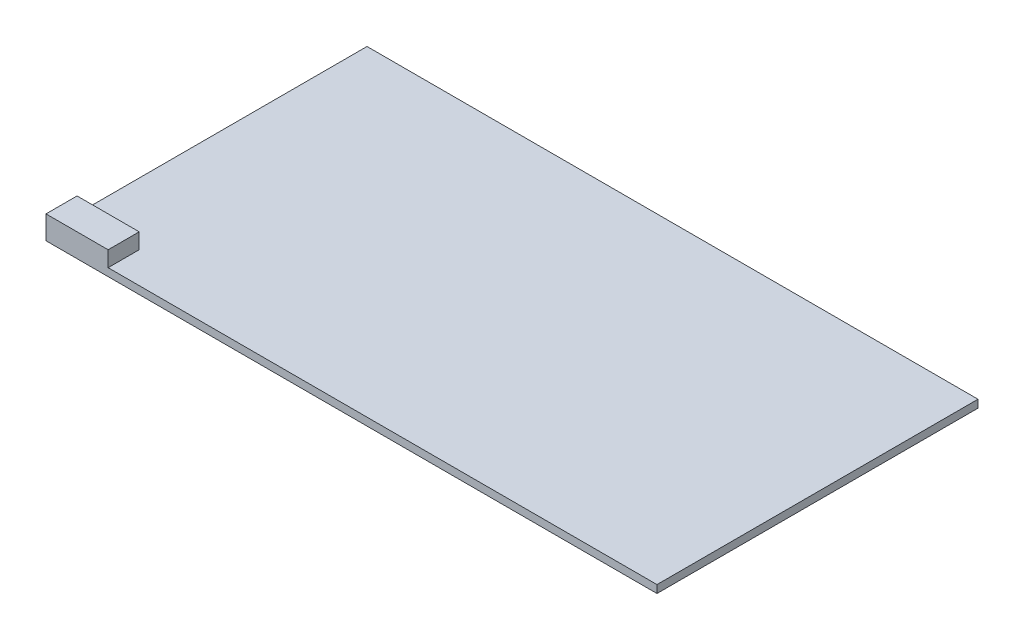
ISO-10303-21;
HEADER;
FILE_DESCRIPTION(('STEP AP214'),'2;1');
FILE_NAME('part.step','',(''),(''),'','','');
FILE_SCHEMA(('AUTOMOTIVE_DESIGN { 1 0 10303 214 1 1 1 1 }'));
ENDSEC;
DATA;
#1=APPLICATION_CONTEXT('core data for automotive mechanical design processes');
#2=APPLICATION_PROTOCOL_DEFINITION('international standard','automotive_design',2000,#1);
#3=PRODUCT_CONTEXT('',#1,'mechanical');
#4=PRODUCT('Part','Part','',(#3));
#5=PRODUCT_RELATED_PRODUCT_CATEGORY('part','',(#4));
#6=PRODUCT_DEFINITION_FORMATION('','',#4);
#7=PRODUCT_DEFINITION_CONTEXT('part definition',#1,'design');
#8=PRODUCT_DEFINITION('design','',#6,#7);
#9=PRODUCT_DEFINITION_SHAPE('','',#8);
#10=(LENGTH_UNIT() NAMED_UNIT(*) SI_UNIT(.MILLI.,.METRE.));
#11=(NAMED_UNIT(*) PLANE_ANGLE_UNIT() SI_UNIT($,.RADIAN.));
#12=(NAMED_UNIT(*) SI_UNIT($,.STERADIAN.) SOLID_ANGLE_UNIT());
#13=UNCERTAINTY_MEASURE_WITH_UNIT(LENGTH_MEASURE(1.E-05),#10,'distance_accuracy_value','');
#14=(GEOMETRIC_REPRESENTATION_CONTEXT(3) GLOBAL_UNCERTAINTY_ASSIGNED_CONTEXT((#13)) GLOBAL_UNIT_ASSIGNED_CONTEXT((#10,
#11,#12)) REPRESENTATION_CONTEXT('',''));
#15=CARTESIAN_POINT('',(0.,0.,0.));
#16=DIRECTION('',(0.,0.,1.));
#17=DIRECTION('',(1.,0.,0.));
#18=AXIS2_PLACEMENT_3D('',#15,#16,#17);
#19=CARTESIAN_POINT('',(0.,1.5,-62.));
#20=DIRECTION('',(1.,0.,0.));
#21=DIRECTION('',(0.,0.,-1.));
#22=AXIS2_PLACEMENT_3D('',#19,#20,#21);
#23=PLANE('',#22);
#24=DIRECTION('',(0.,0.,1.));
#25=VECTOR('',#24,1.);
#26=CARTESIAN_POINT('',(0.,0.,-62.));
#27=LINE('',#26,#25);
#28=CARTESIAN_POINT('',(0.,0.,-62.));
#29=VERTEX_POINT('',#28);
#30=CARTESIAN_POINT('',(0.,0.,0.));
#31=VERTEX_POINT('',#30);
#32=EDGE_CURVE('E111',#29,#31,#27,.T.);
#33=ORIENTED_EDGE('',*,*,#32,.T.);
#34=DIRECTION('',(0.,-1.,0.));
#35=VECTOR('',#34,1.);
#36=CARTESIAN_POINT('',(0.,1.5,0.));
#37=LINE('',#36,#35);
#38=CARTESIAN_POINT('',(0.,4.5,0.));
#39=VERTEX_POINT('',#38);
#40=EDGE_CURVE('E11',#39,#31,#37,.T.);
#41=ORIENTED_EDGE('',*,*,#40,.F.);
#42=DIRECTION('',(0.,0.,1.));
#43=VECTOR('',#42,1.);
#44=CARTESIAN_POINT('',(0.,4.5,-6.));
#45=LINE('',#44,#43);
#46=CARTESIAN_POINT('',(0.,4.5,-6.));
#47=VERTEX_POINT('',#46);
#48=EDGE_CURVE('E108',#47,#39,#45,.T.);
#49=ORIENTED_EDGE('',*,*,#48,.F.);
#50=DIRECTION('',(0.,-1.,0.));
#51=VECTOR('',#50,1.);
#52=CARTESIAN_POINT('',(0.,4.5,-6.));
#53=LINE('',#52,#51);
#54=CARTESIAN_POINT('',(0.,1.5,-6.));
#55=VERTEX_POINT('',#54);
#56=EDGE_CURVE('E137',#47,#55,#53,.T.);
#57=ORIENTED_EDGE('',*,*,#56,.T.);
#58=DIRECTION('',(0.,0.,1.));
#59=VECTOR('',#58,1.);
#60=CARTESIAN_POINT('',(0.,1.5,-62.));
#61=LINE('',#60,#59);
#62=CARTESIAN_POINT('',(0.,1.5,-62.));
#63=VERTEX_POINT('',#62);
#64=EDGE_CURVE('E68',#63,#55,#61,.T.);
#65=ORIENTED_EDGE('',*,*,#64,.F.);
#66=DIRECTION('',(0.,-1.,0.));
#67=VECTOR('',#66,1.);
#68=CARTESIAN_POINT('',(0.,1.5,-62.));
#69=LINE('',#68,#67);
#70=EDGE_CURVE('E160',#63,#29,#69,.T.);
#71=ORIENTED_EDGE('',*,*,#70,.T.);
#72=EDGE_LOOP('',(#33,#41,#49,#57,#65,#71));
#73=FACE_BOUND('',#72,.T.);
#74=ADVANCED_FACE('F47',(#73),#23,.F.);
#75=CARTESIAN_POINT('',(0.,1.5,0.));
#76=DIRECTION('',(0.,0.,-1.));
#77=DIRECTION('',(-1.,0.,0.));
#78=AXIS2_PLACEMENT_3D('',#75,#76,#77);
#79=PLANE('',#78);
#80=DIRECTION('',(1.,0.,0.));
#81=VECTOR('',#80,1.);
#82=CARTESIAN_POINT('',(0.,0.,0.));
#83=LINE('',#82,#81);
#84=CARTESIAN_POINT('',(118.,0.,0.));
#85=VERTEX_POINT('',#84);
#86=EDGE_CURVE('E163',#31,#85,#83,.T.);
#87=ORIENTED_EDGE('',*,*,#86,.T.);
#88=DIRECTION('',(0.,-1.,0.));
#89=VECTOR('',#88,1.);
#90=CARTESIAN_POINT('',(118.,1.5,0.));
#91=LINE('',#90,#89);
#92=CARTESIAN_POINT('',(118.,1.5,0.));
#93=VERTEX_POINT('',#92);
#94=EDGE_CURVE('E55',#93,#85,#91,.T.);
#95=ORIENTED_EDGE('',*,*,#94,.F.);
#96=DIRECTION('',(1.,0.,0.));
#97=VECTOR('',#96,1.);
#98=CARTESIAN_POINT('',(0.,1.5,0.));
#99=LINE('',#98,#97);
#100=CARTESIAN_POINT('',(12.,1.5,0.));
#101=VERTEX_POINT('',#100);
#102=EDGE_CURVE('E150',#101,#93,#99,.T.);
#103=ORIENTED_EDGE('',*,*,#102,.F.);
#104=DIRECTION('',(0.,-1.,0.));
#105=VECTOR('',#104,1.);
#106=CARTESIAN_POINT('',(12.,4.5,0.));
#107=LINE('',#106,#105);
#108=CARTESIAN_POINT('',(12.,4.5,0.));
#109=VERTEX_POINT('',#108);
#110=EDGE_CURVE('E117',#109,#101,#107,.T.);
#111=ORIENTED_EDGE('',*,*,#110,.F.);
#112=DIRECTION('',(1.,0.,0.));
#113=VECTOR('',#112,1.);
#114=CARTESIAN_POINT('',(0.,4.5,0.));
#115=LINE('',#114,#113);
#116=EDGE_CURVE('E114',#39,#109,#115,.T.);
#117=ORIENTED_EDGE('',*,*,#116,.F.);
#118=ORIENTED_EDGE('',*,*,#40,.T.);
#119=EDGE_LOOP('',(#87,#95,#103,#111,#117,#118));
#120=FACE_BOUND('',#119,.T.);
#121=ADVANCED_FACE('F115',(#120),#79,.F.);
#122=CARTESIAN_POINT('',(118.,1.5,0.));
#123=DIRECTION('',(-1.,0.,0.));
#124=DIRECTION('',(0.,0.,1.));
#125=AXIS2_PLACEMENT_3D('',#122,#123,#124);
#126=PLANE('',#125);
#127=DIRECTION('',(0.,0.,-1.));
#128=VECTOR('',#127,1.);
#129=CARTESIAN_POINT('',(118.,0.,0.));
#130=LINE('',#129,#128);
#131=CARTESIAN_POINT('',(118.,0.,-62.));
#132=VERTEX_POINT('',#131);
#133=EDGE_CURVE('E166',#85,#132,#130,.T.);
#134=ORIENTED_EDGE('',*,*,#133,.T.);
#135=DIRECTION('',(0.,-1.,0.));
#136=VECTOR('',#135,1.);
#137=CARTESIAN_POINT('',(118.,1.5,-62.));
#138=LINE('',#137,#136);
#139=CARTESIAN_POINT('',(118.,1.5,-62.));
#140=VERTEX_POINT('',#139);
#141=EDGE_CURVE('E173',#140,#132,#138,.T.);
#142=ORIENTED_EDGE('',*,*,#141,.F.);
#143=DIRECTION('',(0.,0.,-1.));
#144=VECTOR('',#143,1.);
#145=CARTESIAN_POINT('',(118.,1.5,0.));
#146=LINE('',#145,#144);
#147=EDGE_CURVE('E154',#93,#140,#146,.T.);
#148=ORIENTED_EDGE('',*,*,#147,.F.);
#149=ORIENTED_EDGE('',*,*,#94,.T.);
#150=EDGE_LOOP('',(#134,#142,#148,#149));
#151=FACE_BOUND('',#150,.T.);
#152=ADVANCED_FACE('F182',(#151),#126,.F.);
#153=CARTESIAN_POINT('',(0.,1.5,-62.));
#154=DIRECTION('',(0.,0.,1.));
#155=DIRECTION('',(1.,0.,0.));
#156=AXIS2_PLACEMENT_3D('',#153,#154,#155);
#157=PLANE('',#156);
#158=DIRECTION('',(-1.,0.,0.));
#159=VECTOR('',#158,1.);
#160=CARTESIAN_POINT('',(0.,0.,-62.));
#161=LINE('',#160,#159);
#162=EDGE_CURVE('E151',#132,#29,#161,.T.);
#163=ORIENTED_EDGE('',*,*,#162,.T.);
#164=ORIENTED_EDGE('',*,*,#70,.F.);
#165=DIRECTION('',(-1.,0.,0.));
#166=VECTOR('',#165,1.);
#167=CARTESIAN_POINT('',(0.,1.5,-62.));
#168=LINE('',#167,#166);
#169=EDGE_CURVE('E157',#140,#63,#168,.T.);
#170=ORIENTED_EDGE('',*,*,#169,.F.);
#171=ORIENTED_EDGE('',*,*,#141,.T.);
#172=EDGE_LOOP('',(#163,#164,#170,#171));
#173=FACE_BOUND('',#172,.T.);
#174=ADVANCED_FACE('F189',(#173),#157,.F.);
#175=CARTESIAN_POINT('',(0.,1.5,0.));
#176=DIRECTION('',(0.,1.,0.));
#177=DIRECTION('',(0.,0.,1.));
#178=AXIS2_PLACEMENT_3D('',#175,#176,#177);
#179=PLANE('',#178);
#180=DIRECTION('',(-1.,0.,0.));
#181=VECTOR('',#180,1.);
#182=CARTESIAN_POINT('',(0.,1.5,-6.));
#183=LINE('',#182,#181);
#184=CARTESIAN_POINT('',(12.,1.5,-6.));
#185=VERTEX_POINT('',#184);
#186=EDGE_CURVE('E128',#185,#55,#183,.T.);
#187=ORIENTED_EDGE('',*,*,#186,.F.);
#188=DIRECTION('',(0.,0.,-1.));
#189=VECTOR('',#188,1.);
#190=CARTESIAN_POINT('',(12.,1.5,-6.));
#191=LINE('',#190,#189);
#192=EDGE_CURVE('E62',#101,#185,#191,.T.);
#193=ORIENTED_EDGE('',*,*,#192,.F.);
#194=ORIENTED_EDGE('',*,*,#102,.T.);
#195=ORIENTED_EDGE('',*,*,#147,.T.);
#196=ORIENTED_EDGE('',*,*,#169,.T.);
#197=ORIENTED_EDGE('',*,*,#64,.T.);
#198=EDGE_LOOP('',(#187,#193,#194,#195,#196,#197));
#199=FACE_BOUND('',#198,.T.);
#200=ADVANCED_FACE('F194',(#199),#179,.T.);
#201=CARTESIAN_POINT('',(0.,0.,0.));
#202=DIRECTION('',(0.,1.,0.));
#203=DIRECTION('',(0.,0.,1.));
#204=AXIS2_PLACEMENT_3D('',#201,#202,#203);
#205=PLANE('',#204);
#206=ORIENTED_EDGE('',*,*,#32,.F.);
#207=ORIENTED_EDGE('',*,*,#162,.F.);
#208=ORIENTED_EDGE('',*,*,#133,.F.);
#209=ORIENTED_EDGE('',*,*,#86,.F.);
#210=EDGE_LOOP('',(#206,#207,#208,#209));
#211=FACE_BOUND('',#210,.T.);
#212=ADVANCED_FACE('F186',(#211),#205,.F.);
#213=CARTESIAN_POINT('',(12.,4.5,-6.));
#214=DIRECTION('',(-1.,0.,0.));
#215=DIRECTION('',(0.,0.,1.));
#216=AXIS2_PLACEMENT_3D('',#213,#214,#215);
#217=PLANE('',#216);
#218=ORIENTED_EDGE('',*,*,#192,.T.);
#219=DIRECTION('',(0.,-1.,0.));
#220=VECTOR('',#219,1.);
#221=CARTESIAN_POINT('',(12.,4.5,-6.));
#222=LINE('',#221,#220);
#223=CARTESIAN_POINT('',(12.,4.5,-6.));
#224=VERTEX_POINT('',#223);
#225=EDGE_CURVE('E142',#224,#185,#222,.T.);
#226=ORIENTED_EDGE('',*,*,#225,.F.);
#227=DIRECTION('',(0.,0.,-1.));
#228=VECTOR('',#227,1.);
#229=CARTESIAN_POINT('',(12.,4.5,-6.));
#230=LINE('',#229,#228);
#231=EDGE_CURVE('E121',#109,#224,#230,.T.);
#232=ORIENTED_EDGE('',*,*,#231,.F.);
#233=ORIENTED_EDGE('',*,*,#110,.T.);
#234=EDGE_LOOP('',(#218,#226,#232,#233));
#235=FACE_BOUND('',#234,.T.);
#236=ADVANCED_FACE('F196',(#235),#217,.F.);
#237=CARTESIAN_POINT('',(0.,4.5,-6.));
#238=DIRECTION('',(0.,0.,1.));
#239=DIRECTION('',(1.,0.,0.));
#240=AXIS2_PLACEMENT_3D('',#237,#238,#239);
#241=PLANE('',#240);
#242=ORIENTED_EDGE('',*,*,#186,.T.);
#243=ORIENTED_EDGE('',*,*,#56,.F.);
#244=DIRECTION('',(-1.,0.,0.));
#245=VECTOR('',#244,1.);
#246=CARTESIAN_POINT('',(0.,4.5,-6.));
#247=LINE('',#246,#245);
#248=EDGE_CURVE('E125',#224,#47,#247,.T.);
#249=ORIENTED_EDGE('',*,*,#248,.F.);
#250=ORIENTED_EDGE('',*,*,#225,.T.);
#251=EDGE_LOOP('',(#242,#243,#249,#250));
#252=FACE_BOUND('',#251,.T.);
#253=ADVANCED_FACE('F192',(#252),#241,.F.);
#254=CARTESIAN_POINT('',(0.,4.5,0.));
#255=DIRECTION('',(0.,1.,0.));
#256=DIRECTION('',(0.,0.,1.));
#257=AXIS2_PLACEMENT_3D('',#254,#255,#256);
#258=PLANE('',#257);
#259=ORIENTED_EDGE('',*,*,#48,.T.);
#260=ORIENTED_EDGE('',*,*,#116,.T.);
#261=ORIENTED_EDGE('',*,*,#231,.T.);
#262=ORIENTED_EDGE('',*,*,#248,.T.);
#263=EDGE_LOOP('',(#259,#260,#261,#262));
#264=FACE_BOUND('',#263,.T.);
#265=ADVANCED_FACE('F123',(#264),#258,.T.);
#266=CLOSED_SHELL('',(#74,#121,#152,#174,#200,#212,#236,#253,#265));
#267=MANIFOLD_SOLID_BREP('B2',#266);
#268=ADVANCED_BREP_SHAPE_REPRESENTATION('',(#18,#267),#14);
#269=SHAPE_DEFINITION_REPRESENTATION(#9,#268);
ENDSEC;
END-ISO-10303-21;
